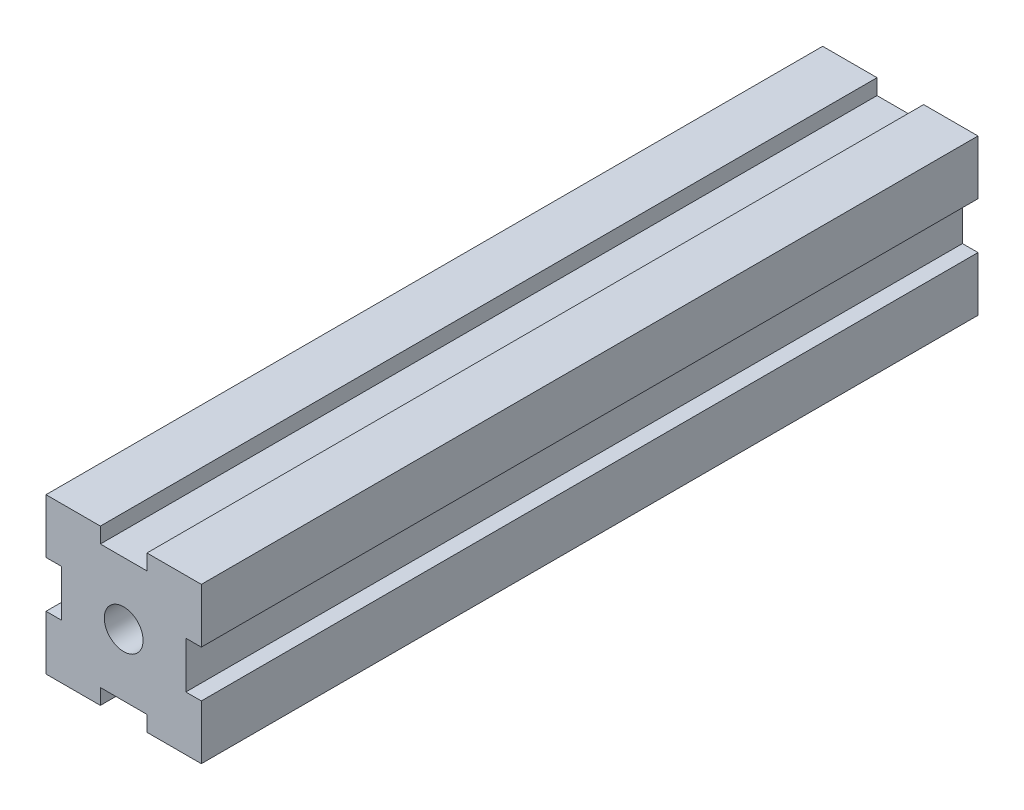
ISO-10303-21;
HEADER;
FILE_DESCRIPTION(('STEP AP214'),'2;1');
FILE_NAME('part.step','',(''),(''),'','','');
FILE_SCHEMA(('AUTOMOTIVE_DESIGN { 1 0 10303 214 1 1 1 1 }'));
ENDSEC;
DATA;
#1=APPLICATION_CONTEXT('core data for automotive mechanical design processes');
#2=APPLICATION_PROTOCOL_DEFINITION('international standard','automotive_design',2000,#1);
#3=PRODUCT_CONTEXT('',#1,'mechanical');
#4=PRODUCT('Part','Part','',(#3));
#5=PRODUCT_RELATED_PRODUCT_CATEGORY('part','',(#4));
#6=PRODUCT_DEFINITION_FORMATION('','',#4);
#7=PRODUCT_DEFINITION_CONTEXT('part definition',#1,'design');
#8=PRODUCT_DEFINITION('design','',#6,#7);
#9=PRODUCT_DEFINITION_SHAPE('','',#8);
#10=(LENGTH_UNIT() NAMED_UNIT(*) SI_UNIT(.MILLI.,.METRE.));
#11=(NAMED_UNIT(*) PLANE_ANGLE_UNIT() SI_UNIT($,.RADIAN.));
#12=(NAMED_UNIT(*) SI_UNIT($,.STERADIAN.) SOLID_ANGLE_UNIT());
#13=UNCERTAINTY_MEASURE_WITH_UNIT(LENGTH_MEASURE(1.E-05),#10,'distance_accuracy_value','');
#14=(GEOMETRIC_REPRESENTATION_CONTEXT(3) GLOBAL_UNCERTAINTY_ASSIGNED_CONTEXT((#13)) GLOBAL_UNIT_ASSIGNED_CONTEXT((#10,
#11,#12)) REPRESENTATION_CONTEXT('',''));
#15=CARTESIAN_POINT('',(0.,0.,0.));
#16=DIRECTION('',(0.,0.,1.));
#17=DIRECTION('',(1.,0.,0.));
#18=AXIS2_PLACEMENT_3D('',#15,#16,#17);
#19=CARTESIAN_POINT('',(0.,0.,100.));
#20=DIRECTION('',(0.,0.,1.));
#21=DIRECTION('',(1.,0.,0.));
#22=AXIS2_PLACEMENT_3D('',#19,#20,#21);
#23=PLANE('',#22);
#24=DIRECTION('',(0.,-1.,0.));
#25=VECTOR('',#24,1.);
#26=CARTESIAN_POINT('',(0.,0.,100.));
#27=LINE('',#26,#25);
#28=CARTESIAN_POINT('',(0.,0.,100.));
#29=VERTEX_POINT('',#28);
#30=CARTESIAN_POINT('',(0.,-7.,100.));
#31=VERTEX_POINT('',#30);
#32=EDGE_CURVE('E242',#29,#31,#27,.T.);
#33=ORIENTED_EDGE('',*,*,#32,.T.);
#34=DIRECTION('',(1.,0.,0.));
#35=VECTOR('',#34,1.);
#36=CARTESIAN_POINT('',(0.,-7.,100.));
#37=LINE('',#36,#35);
#38=CARTESIAN_POINT('',(2.,-7.,100.));
#39=VERTEX_POINT('',#38);
#40=EDGE_CURVE('E130',#31,#39,#37,.T.);
#41=ORIENTED_EDGE('',*,*,#40,.T.);
#42=DIRECTION('',(0.,-1.,0.));
#43=VECTOR('',#42,1.);
#44=CARTESIAN_POINT('',(2.,-7.,100.));
#45=LINE('',#44,#43);
#46=CARTESIAN_POINT('',(2.,-13.,100.));
#47=VERTEX_POINT('',#46);
#48=EDGE_CURVE('E293',#39,#47,#45,.T.);
#49=ORIENTED_EDGE('',*,*,#48,.T.);
#50=DIRECTION('',(-1.,0.,0.));
#51=VECTOR('',#50,1.);
#52=CARTESIAN_POINT('',(0.,-13.,100.));
#53=LINE('',#52,#51);
#54=CARTESIAN_POINT('',(0.,-13.,100.));
#55=VERTEX_POINT('',#54);
#56=EDGE_CURVE('E312',#47,#55,#53,.T.);
#57=ORIENTED_EDGE('',*,*,#56,.T.);
#58=DIRECTION('',(0.,-1.,0.));
#59=VECTOR('',#58,1.);
#60=CARTESIAN_POINT('',(0.,-13.,100.));
#61=LINE('',#60,#59);
#62=CARTESIAN_POINT('',(0.,-20.,100.));
#63=VERTEX_POINT('',#62);
#64=EDGE_CURVE('E309',#55,#63,#61,.T.);
#65=ORIENTED_EDGE('',*,*,#64,.T.);
#66=DIRECTION('',(1.,0.,0.));
#67=VECTOR('',#66,1.);
#68=CARTESIAN_POINT('',(0.,-20.,100.));
#69=LINE('',#68,#67);
#70=CARTESIAN_POINT('',(7.,-20.,100.));
#71=VERTEX_POINT('',#70);
#72=EDGE_CURVE('E311',#63,#71,#69,.T.);
#73=ORIENTED_EDGE('',*,*,#72,.T.);
#74=DIRECTION('',(0.,1.,0.));
#75=VECTOR('',#74,1.);
#76=CARTESIAN_POINT('',(7.,-20.,100.));
#77=LINE('',#76,#75);
#78=CARTESIAN_POINT('',(7.,-18.,100.));
#79=VERTEX_POINT('',#78);
#80=EDGE_CURVE('E314',#71,#79,#77,.T.);
#81=ORIENTED_EDGE('',*,*,#80,.T.);
#82=DIRECTION('',(1.,0.,0.));
#83=VECTOR('',#82,1.);
#84=CARTESIAN_POINT('',(7.,-18.,100.));
#85=LINE('',#84,#83);
#86=CARTESIAN_POINT('',(13.,-18.,100.));
#87=VERTEX_POINT('',#86);
#88=EDGE_CURVE('E320',#79,#87,#85,.T.);
#89=ORIENTED_EDGE('',*,*,#88,.T.);
#90=DIRECTION('',(0.,-1.,0.));
#91=VECTOR('',#90,1.);
#92=CARTESIAN_POINT('',(13.,-20.,100.));
#93=LINE('',#92,#91);
#94=CARTESIAN_POINT('',(13.,-20.,100.));
#95=VERTEX_POINT('',#94);
#96=EDGE_CURVE('E322',#87,#95,#93,.T.);
#97=ORIENTED_EDGE('',*,*,#96,.T.);
#98=DIRECTION('',(1.,0.,0.));
#99=VECTOR('',#98,1.);
#100=CARTESIAN_POINT('',(13.,-20.,100.));
#101=LINE('',#100,#99);
#102=CARTESIAN_POINT('',(20.,-20.,100.));
#103=VERTEX_POINT('',#102);
#104=EDGE_CURVE('E324',#95,#103,#101,.T.);
#105=ORIENTED_EDGE('',*,*,#104,.T.);
#106=DIRECTION('',(0.,1.,0.));
#107=VECTOR('',#106,1.);
#108=CARTESIAN_POINT('',(20.,-13.,100.));
#109=LINE('',#108,#107);
#110=CARTESIAN_POINT('',(20.,-13.,100.));
#111=VERTEX_POINT('',#110);
#112=EDGE_CURVE('E326',#103,#111,#109,.T.);
#113=ORIENTED_EDGE('',*,*,#112,.T.);
#114=DIRECTION('',(-1.,0.,0.));
#115=VECTOR('',#114,1.);
#116=CARTESIAN_POINT('',(20.,-13.,100.));
#117=LINE('',#116,#115);
#118=CARTESIAN_POINT('',(18.,-13.,100.));
#119=VERTEX_POINT('',#118);
#120=EDGE_CURVE('E328',#111,#119,#117,.T.);
#121=ORIENTED_EDGE('',*,*,#120,.T.);
#122=DIRECTION('',(0.,1.,0.));
#123=VECTOR('',#122,1.);
#124=CARTESIAN_POINT('',(18.,-7.,100.));
#125=LINE('',#124,#123);
#126=CARTESIAN_POINT('',(18.,-7.,100.));
#127=VERTEX_POINT('',#126);
#128=EDGE_CURVE('E330',#119,#127,#125,.T.);
#129=ORIENTED_EDGE('',*,*,#128,.T.);
#130=DIRECTION('',(1.,0.,0.));
#131=VECTOR('',#130,1.);
#132=CARTESIAN_POINT('',(20.,-7.,100.));
#133=LINE('',#132,#131);
#134=CARTESIAN_POINT('',(20.,-7.,100.));
#135=VERTEX_POINT('',#134);
#136=EDGE_CURVE('E332',#127,#135,#133,.T.);
#137=ORIENTED_EDGE('',*,*,#136,.T.);
#138=DIRECTION('',(0.,1.,0.));
#139=VECTOR('',#138,1.);
#140=CARTESIAN_POINT('',(20.,0.,100.));
#141=LINE('',#140,#139);
#142=CARTESIAN_POINT('',(20.,0.,100.));
#143=VERTEX_POINT('',#142);
#144=EDGE_CURVE('E334',#135,#143,#141,.T.);
#145=ORIENTED_EDGE('',*,*,#144,.T.);
#146=DIRECTION('',(-1.,0.,0.));
#147=VECTOR('',#146,1.);
#148=CARTESIAN_POINT('',(13.,0.,100.));
#149=LINE('',#148,#147);
#150=CARTESIAN_POINT('',(13.,0.,100.));
#151=VERTEX_POINT('',#150);
#152=EDGE_CURVE('E336',#143,#151,#149,.T.);
#153=ORIENTED_EDGE('',*,*,#152,.T.);
#154=DIRECTION('',(0.,-1.,0.));
#155=VECTOR('',#154,1.);
#156=CARTESIAN_POINT('',(13.,0.,100.));
#157=LINE('',#156,#155);
#158=CARTESIAN_POINT('',(13.,-2.,100.));
#159=VERTEX_POINT('',#158);
#160=EDGE_CURVE('E185',#151,#159,#157,.T.);
#161=ORIENTED_EDGE('',*,*,#160,.T.);
#162=DIRECTION('',(-1.,0.,0.));
#163=VECTOR('',#162,1.);
#164=CARTESIAN_POINT('',(7.,-2.,100.));
#165=LINE('',#164,#163);
#166=CARTESIAN_POINT('',(7.,-2.,100.));
#167=VERTEX_POINT('',#166);
#168=EDGE_CURVE('E179',#159,#167,#165,.T.);
#169=ORIENTED_EDGE('',*,*,#168,.T.);
#170=DIRECTION('',(0.,1.,0.));
#171=VECTOR('',#170,1.);
#172=CARTESIAN_POINT('',(7.,0.,100.));
#173=LINE('',#172,#171);
#174=CARTESIAN_POINT('',(7.,0.,100.));
#175=VERTEX_POINT('',#174);
#176=EDGE_CURVE('E183',#167,#175,#173,.T.);
#177=ORIENTED_EDGE('',*,*,#176,.T.);
#178=DIRECTION('',(-1.,0.,0.));
#179=VECTOR('',#178,1.);
#180=CARTESIAN_POINT('',(0.,0.,100.));
#181=LINE('',#180,#179);
#182=EDGE_CURVE('E51',#175,#29,#181,.T.);
#183=ORIENTED_EDGE('',*,*,#182,.T.);
#184=EDGE_LOOP('',(#33,#41,#49,#57,#65,#73,#81,#89,#97,#105,#113,#121,#129,#137,#145,#153,#161,
#169,#177,#183));
#185=FACE_BOUND('',#184,.T.);
#186=CARTESIAN_POINT('',(10.,-10.,100.));
#187=DIRECTION('',(0.,0.,1.));
#188=DIRECTION('',(1.,0.,0.));
#189=AXIS2_PLACEMENT_3D('',#186,#187,#188);
#190=CIRCLE('',#189,2.5);
#191=CARTESIAN_POINT('',(12.5,-10.,100.));
#192=VERTEX_POINT('',#191);
#193=EDGE_CURVE('E207',#192,#192,#190,.T.);
#194=ORIENTED_EDGE('',*,*,#193,.F.);
#195=EDGE_LOOP('',(#194));
#196=FACE_BOUND('',#195,.T.);
#197=ADVANCED_FACE('F34',(#185,#196),#23,.T.);
#198=CARTESIAN_POINT('',(0.,0.,0.));
#199=DIRECTION('',(0.,0.,1.));
#200=DIRECTION('',(1.,0.,0.));
#201=AXIS2_PLACEMENT_3D('',#198,#199,#200);
#202=PLANE('',#201);
#203=DIRECTION('',(0.,-1.,0.));
#204=VECTOR('',#203,1.);
#205=CARTESIAN_POINT('',(0.,0.,0.));
#206=LINE('',#205,#204);
#207=CARTESIAN_POINT('',(0.,0.,0.));
#208=VERTEX_POINT('',#207);
#209=CARTESIAN_POINT('',(0.,-7.,0.));
#210=VERTEX_POINT('',#209);
#211=EDGE_CURVE('E203',#208,#210,#206,.T.);
#212=ORIENTED_EDGE('',*,*,#211,.F.);
#213=DIRECTION('',(-1.,0.,0.));
#214=VECTOR('',#213,1.);
#215=CARTESIAN_POINT('',(0.,0.,0.));
#216=LINE('',#215,#214);
#217=CARTESIAN_POINT('',(7.,0.,0.));
#218=VERTEX_POINT('',#217);
#219=EDGE_CURVE('E122',#218,#208,#216,.T.);
#220=ORIENTED_EDGE('',*,*,#219,.F.);
#221=DIRECTION('',(0.,1.,0.));
#222=VECTOR('',#221,1.);
#223=CARTESIAN_POINT('',(7.,0.,0.));
#224=LINE('',#223,#222);
#225=CARTESIAN_POINT('',(7.,-2.,0.));
#226=VERTEX_POINT('',#225);
#227=EDGE_CURVE('E116',#226,#218,#224,.T.);
#228=ORIENTED_EDGE('',*,*,#227,.F.);
#229=DIRECTION('',(-1.,0.,0.));
#230=VECTOR('',#229,1.);
#231=CARTESIAN_POINT('',(7.,-2.,0.));
#232=LINE('',#231,#230);
#233=CARTESIAN_POINT('',(13.,-2.,0.));
#234=VERTEX_POINT('',#233);
#235=EDGE_CURVE('E193',#234,#226,#232,.T.);
#236=ORIENTED_EDGE('',*,*,#235,.F.);
#237=DIRECTION('',(0.,-1.,0.));
#238=VECTOR('',#237,1.);
#239=CARTESIAN_POINT('',(13.,0.,0.));
#240=LINE('',#239,#238);
#241=CARTESIAN_POINT('',(13.,0.,0.));
#242=VERTEX_POINT('',#241);
#243=EDGE_CURVE('E237',#242,#234,#240,.T.);
#244=ORIENTED_EDGE('',*,*,#243,.F.);
#245=DIRECTION('',(-1.,0.,0.));
#246=VECTOR('',#245,1.);
#247=CARTESIAN_POINT('',(13.,0.,0.));
#248=LINE('',#247,#246);
#249=CARTESIAN_POINT('',(20.,0.,0.));
#250=VERTEX_POINT('',#249);
#251=EDGE_CURVE('E235',#250,#242,#248,.T.);
#252=ORIENTED_EDGE('',*,*,#251,.F.);
#253=DIRECTION('',(0.,1.,0.));
#254=VECTOR('',#253,1.);
#255=CARTESIAN_POINT('',(20.,0.,0.));
#256=LINE('',#255,#254);
#257=CARTESIAN_POINT('',(20.,-7.,0.));
#258=VERTEX_POINT('',#257);
#259=EDGE_CURVE('E233',#258,#250,#256,.T.);
#260=ORIENTED_EDGE('',*,*,#259,.F.);
#261=DIRECTION('',(1.,0.,0.));
#262=VECTOR('',#261,1.);
#263=CARTESIAN_POINT('',(20.,-7.,0.));
#264=LINE('',#263,#262);
#265=CARTESIAN_POINT('',(18.,-7.,0.));
#266=VERTEX_POINT('',#265);
#267=EDGE_CURVE('E231',#266,#258,#264,.T.);
#268=ORIENTED_EDGE('',*,*,#267,.F.);
#269=DIRECTION('',(0.,1.,0.));
#270=VECTOR('',#269,1.);
#271=CARTESIAN_POINT('',(18.,-7.,0.));
#272=LINE('',#271,#270);
#273=CARTESIAN_POINT('',(18.,-13.,0.));
#274=VERTEX_POINT('',#273);
#275=EDGE_CURVE('E229',#274,#266,#272,.T.);
#276=ORIENTED_EDGE('',*,*,#275,.F.);
#277=DIRECTION('',(-1.,0.,0.));
#278=VECTOR('',#277,1.);
#279=CARTESIAN_POINT('',(20.,-13.,0.));
#280=LINE('',#279,#278);
#281=CARTESIAN_POINT('',(20.,-13.,0.));
#282=VERTEX_POINT('',#281);
#283=EDGE_CURVE('E227',#282,#274,#280,.T.);
#284=ORIENTED_EDGE('',*,*,#283,.F.);
#285=DIRECTION('',(0.,1.,0.));
#286=VECTOR('',#285,1.);
#287=CARTESIAN_POINT('',(20.,-13.,0.));
#288=LINE('',#287,#286);
#289=CARTESIAN_POINT('',(20.,-20.,0.));
#290=VERTEX_POINT('',#289);
#291=EDGE_CURVE('E225',#290,#282,#288,.T.);
#292=ORIENTED_EDGE('',*,*,#291,.F.);
#293=DIRECTION('',(1.,0.,0.));
#294=VECTOR('',#293,1.);
#295=CARTESIAN_POINT('',(13.,-20.,0.));
#296=LINE('',#295,#294);
#297=CARTESIAN_POINT('',(13.,-20.,0.));
#298=VERTEX_POINT('',#297);
#299=EDGE_CURVE('E223',#298,#290,#296,.T.);
#300=ORIENTED_EDGE('',*,*,#299,.F.);
#301=DIRECTION('',(0.,-1.,0.));
#302=VECTOR('',#301,1.);
#303=CARTESIAN_POINT('',(13.,-20.,0.));
#304=LINE('',#303,#302);
#305=CARTESIAN_POINT('',(13.,-18.,0.));
#306=VERTEX_POINT('',#305);
#307=EDGE_CURVE('E221',#306,#298,#304,.T.);
#308=ORIENTED_EDGE('',*,*,#307,.F.);
#309=DIRECTION('',(1.,0.,0.));
#310=VECTOR('',#309,1.);
#311=CARTESIAN_POINT('',(7.,-18.,0.));
#312=LINE('',#311,#310);
#313=CARTESIAN_POINT('',(7.,-18.,0.));
#314=VERTEX_POINT('',#313);
#315=EDGE_CURVE('E219',#314,#306,#312,.T.);
#316=ORIENTED_EDGE('',*,*,#315,.F.);
#317=DIRECTION('',(0.,1.,0.));
#318=VECTOR('',#317,1.);
#319=CARTESIAN_POINT('',(7.,-20.,0.));
#320=LINE('',#319,#318);
#321=CARTESIAN_POINT('',(7.,-20.,0.));
#322=VERTEX_POINT('',#321);
#323=EDGE_CURVE('E217',#322,#314,#320,.T.);
#324=ORIENTED_EDGE('',*,*,#323,.F.);
#325=DIRECTION('',(1.,0.,0.));
#326=VECTOR('',#325,1.);
#327=CARTESIAN_POINT('',(0.,-20.,0.));
#328=LINE('',#327,#326);
#329=CARTESIAN_POINT('',(0.,-20.,0.));
#330=VERTEX_POINT('',#329);
#331=EDGE_CURVE('E215',#330,#322,#328,.T.);
#332=ORIENTED_EDGE('',*,*,#331,.F.);
#333=DIRECTION('',(0.,-1.,0.));
#334=VECTOR('',#333,1.);
#335=CARTESIAN_POINT('',(0.,-13.,0.));
#336=LINE('',#335,#334);
#337=CARTESIAN_POINT('',(0.,-13.,0.));
#338=VERTEX_POINT('',#337);
#339=EDGE_CURVE('E213',#338,#330,#336,.T.);
#340=ORIENTED_EDGE('',*,*,#339,.F.);
#341=DIRECTION('',(-1.,0.,0.));
#342=VECTOR('',#341,1.);
#343=CARTESIAN_POINT('',(0.,-13.,0.));
#344=LINE('',#343,#342);
#345=CARTESIAN_POINT('',(2.,-13.,0.));
#346=VERTEX_POINT('',#345);
#347=EDGE_CURVE('E211',#346,#338,#344,.T.);
#348=ORIENTED_EDGE('',*,*,#347,.F.);
#349=DIRECTION('',(0.,-1.,0.));
#350=VECTOR('',#349,1.);
#351=CARTESIAN_POINT('',(2.,-7.,0.));
#352=LINE('',#351,#350);
#353=CARTESIAN_POINT('',(2.,-7.,0.));
#354=VERTEX_POINT('',#353);
#355=EDGE_CURVE('E209',#354,#346,#352,.T.);
#356=ORIENTED_EDGE('',*,*,#355,.F.);
#357=DIRECTION('',(1.,0.,0.));
#358=VECTOR('',#357,1.);
#359=CARTESIAN_POINT('',(0.,-7.,0.));
#360=LINE('',#359,#358);
#361=EDGE_CURVE('E206',#210,#354,#360,.T.);
#362=ORIENTED_EDGE('',*,*,#361,.F.);
#363=EDGE_LOOP('',(#212,#220,#228,#236,#244,#252,#260,#268,#276,#284,#292,#300,#308,#316,#324,
#332,#340,#348,#356,#362));
#364=FACE_BOUND('',#363,.T.);
#365=CARTESIAN_POINT('',(10.,-10.,0.));
#366=DIRECTION('',(0.,0.,1.));
#367=DIRECTION('',(1.,0.,0.));
#368=AXIS2_PLACEMENT_3D('',#365,#366,#367);
#369=CIRCLE('',#368,2.5);
#370=CARTESIAN_POINT('',(12.5,-10.,0.));
#371=VERTEX_POINT('',#370);
#372=EDGE_CURVE('E587',#371,#371,#369,.T.);
#373=ORIENTED_EDGE('',*,*,#372,.T.);
#374=EDGE_LOOP('',(#373));
#375=FACE_BOUND('',#374,.T.);
#376=ADVANCED_FACE('F297',(#364,#375),#202,.F.);
#377=CARTESIAN_POINT('',(0.,0.,100.));
#378=DIRECTION('',(1.,0.,0.));
#379=DIRECTION('',(0.,1.,0.));
#380=AXIS2_PLACEMENT_3D('',#377,#378,#379);
#381=PLANE('',#380);
#382=ORIENTED_EDGE('',*,*,#211,.T.);
#383=DIRECTION('',(0.,0.,-1.));
#384=VECTOR('',#383,1.);
#385=CARTESIAN_POINT('',(0.,-7.,100.));
#386=LINE('',#385,#384);
#387=EDGE_CURVE('E11',#31,#210,#386,.T.);
#388=ORIENTED_EDGE('',*,*,#387,.F.);
#389=ORIENTED_EDGE('',*,*,#32,.F.);
#390=DIRECTION('',(0.,0.,-1.));
#391=VECTOR('',#390,1.);
#392=CARTESIAN_POINT('',(0.,0.,100.));
#393=LINE('',#392,#391);
#394=EDGE_CURVE('E199',#29,#208,#393,.T.);
#395=ORIENTED_EDGE('',*,*,#394,.T.);
#396=EDGE_LOOP('',(#382,#388,#389,#395));
#397=FACE_BOUND('',#396,.T.);
#398=ADVANCED_FACE('F36',(#397),#381,.F.);
#399=CARTESIAN_POINT('',(0.,-7.,100.));
#400=DIRECTION('',(0.,1.,0.));
#401=DIRECTION('',(-1.,0.,0.));
#402=AXIS2_PLACEMENT_3D('',#399,#400,#401);
#403=PLANE('',#402);
#404=ORIENTED_EDGE('',*,*,#361,.T.);
#405=DIRECTION('',(0.,0.,-1.));
#406=VECTOR('',#405,1.);
#407=CARTESIAN_POINT('',(2.,-7.,100.));
#408=LINE('',#407,#406);
#409=EDGE_CURVE('E43',#39,#354,#408,.T.);
#410=ORIENTED_EDGE('',*,*,#409,.F.);
#411=ORIENTED_EDGE('',*,*,#40,.F.);
#412=ORIENTED_EDGE('',*,*,#387,.T.);
#413=EDGE_LOOP('',(#404,#410,#411,#412));
#414=FACE_BOUND('',#413,.T.);
#415=ADVANCED_FACE('F370',(#414),#403,.F.);
#416=CARTESIAN_POINT('',(2.,-7.,100.));
#417=DIRECTION('',(1.,0.,0.));
#418=DIRECTION('',(0.,0.,-1.));
#419=AXIS2_PLACEMENT_3D('',#416,#417,#418);
#420=PLANE('',#419);
#421=ORIENTED_EDGE('',*,*,#355,.T.);
#422=DIRECTION('',(0.,0.,-1.));
#423=VECTOR('',#422,1.);
#424=CARTESIAN_POINT('',(2.,-13.,100.));
#425=LINE('',#424,#423);
#426=EDGE_CURVE('E285',#47,#346,#425,.T.);
#427=ORIENTED_EDGE('',*,*,#426,.F.);
#428=ORIENTED_EDGE('',*,*,#48,.F.);
#429=ORIENTED_EDGE('',*,*,#409,.T.);
#430=EDGE_LOOP('',(#421,#427,#428,#429));
#431=FACE_BOUND('',#430,.T.);
#432=ADVANCED_FACE('F291',(#431),#420,.F.);
#433=CARTESIAN_POINT('',(0.,-13.,100.));
#434=DIRECTION('',(0.,-1.,0.));
#435=DIRECTION('',(1.,0.,0.));
#436=AXIS2_PLACEMENT_3D('',#433,#434,#435);
#437=PLANE('',#436);
#438=ORIENTED_EDGE('',*,*,#347,.T.);
#439=DIRECTION('',(0.,0.,-1.));
#440=VECTOR('',#439,1.);
#441=CARTESIAN_POINT('',(0.,-13.,100.));
#442=LINE('',#441,#440);
#443=EDGE_CURVE('E282',#55,#338,#442,.T.);
#444=ORIENTED_EDGE('',*,*,#443,.F.);
#445=ORIENTED_EDGE('',*,*,#56,.F.);
#446=ORIENTED_EDGE('',*,*,#426,.T.);
#447=EDGE_LOOP('',(#438,#444,#445,#446));
#448=FACE_BOUND('',#447,.T.);
#449=ADVANCED_FACE('F303',(#448),#437,.F.);
#450=CARTESIAN_POINT('',(0.,-13.,100.));
#451=DIRECTION('',(1.,0.,0.));
#452=DIRECTION('',(0.,1.,0.));
#453=AXIS2_PLACEMENT_3D('',#450,#451,#452);
#454=PLANE('',#453);
#455=ORIENTED_EDGE('',*,*,#339,.T.);
#456=DIRECTION('',(0.,0.,-1.));
#457=VECTOR('',#456,1.);
#458=CARTESIAN_POINT('',(0.,-20.,100.));
#459=LINE('',#458,#457);
#460=EDGE_CURVE('E279',#63,#330,#459,.T.);
#461=ORIENTED_EDGE('',*,*,#460,.F.);
#462=ORIENTED_EDGE('',*,*,#64,.F.);
#463=ORIENTED_EDGE('',*,*,#443,.T.);
#464=EDGE_LOOP('',(#455,#461,#462,#463));
#465=FACE_BOUND('',#464,.T.);
#466=ADVANCED_FACE('F307',(#465),#454,.F.);
#467=CARTESIAN_POINT('',(0.,-20.,100.));
#468=DIRECTION('',(0.,1.,0.));
#469=DIRECTION('',(0.,0.,1.));
#470=AXIS2_PLACEMENT_3D('',#467,#468,#469);
#471=PLANE('',#470);
#472=ORIENTED_EDGE('',*,*,#331,.T.);
#473=DIRECTION('',(0.,0.,-1.));
#474=VECTOR('',#473,1.);
#475=CARTESIAN_POINT('',(7.,-20.,100.));
#476=LINE('',#475,#474);
#477=EDGE_CURVE('E276',#71,#322,#476,.T.);
#478=ORIENTED_EDGE('',*,*,#477,.F.);
#479=ORIENTED_EDGE('',*,*,#72,.F.);
#480=ORIENTED_EDGE('',*,*,#460,.T.);
#481=EDGE_LOOP('',(#472,#478,#479,#480));
#482=FACE_BOUND('',#481,.T.);
#483=ADVANCED_FACE('F383',(#482),#471,.F.);
#484=CARTESIAN_POINT('',(7.,-20.,100.));
#485=DIRECTION('',(-1.,0.,0.));
#486=DIRECTION('',(0.,-1.,0.));
#487=AXIS2_PLACEMENT_3D('',#484,#485,#486);
#488=PLANE('',#487);
#489=ORIENTED_EDGE('',*,*,#323,.T.);
#490=DIRECTION('',(0.,0.,-1.));
#491=VECTOR('',#490,1.);
#492=CARTESIAN_POINT('',(7.,-18.,100.));
#493=LINE('',#492,#491);
#494=EDGE_CURVE('E273',#79,#314,#493,.T.);
#495=ORIENTED_EDGE('',*,*,#494,.F.);
#496=ORIENTED_EDGE('',*,*,#80,.F.);
#497=ORIENTED_EDGE('',*,*,#477,.T.);
#498=EDGE_LOOP('',(#489,#495,#496,#497));
#499=FACE_BOUND('',#498,.T.);
#500=ADVANCED_FACE('F386',(#499),#488,.F.);
#501=CARTESIAN_POINT('',(7.,-18.,100.));
#502=DIRECTION('',(0.,1.,0.));
#503=DIRECTION('',(0.,0.,1.));
#504=AXIS2_PLACEMENT_3D('',#501,#502,#503);
#505=PLANE('',#504);
#506=ORIENTED_EDGE('',*,*,#315,.T.);
#507=DIRECTION('',(0.,0.,-1.));
#508=VECTOR('',#507,1.);
#509=CARTESIAN_POINT('',(13.,-18.,100.));
#510=LINE('',#509,#508);
#511=EDGE_CURVE('E270',#87,#306,#510,.T.);
#512=ORIENTED_EDGE('',*,*,#511,.F.);
#513=ORIENTED_EDGE('',*,*,#88,.F.);
#514=ORIENTED_EDGE('',*,*,#494,.T.);
#515=EDGE_LOOP('',(#506,#512,#513,#514));
#516=FACE_BOUND('',#515,.T.);
#517=ADVANCED_FACE('F390',(#516),#505,.F.);
#518=CARTESIAN_POINT('',(13.,-20.,100.));
#519=DIRECTION('',(1.,0.,0.));
#520=DIRECTION('',(0.,1.,0.));
#521=AXIS2_PLACEMENT_3D('',#518,#519,#520);
#522=PLANE('',#521);
#523=ORIENTED_EDGE('',*,*,#307,.T.);
#524=DIRECTION('',(0.,0.,-1.));
#525=VECTOR('',#524,1.);
#526=CARTESIAN_POINT('',(13.,-20.,100.));
#527=LINE('',#526,#525);
#528=EDGE_CURVE('E267',#95,#298,#527,.T.);
#529=ORIENTED_EDGE('',*,*,#528,.F.);
#530=ORIENTED_EDGE('',*,*,#96,.F.);
#531=ORIENTED_EDGE('',*,*,#511,.T.);
#532=EDGE_LOOP('',(#523,#529,#530,#531));
#533=FACE_BOUND('',#532,.T.);
#534=ADVANCED_FACE('F394',(#533),#522,.F.);
#535=CARTESIAN_POINT('',(13.,-20.,100.));
#536=DIRECTION('',(0.,1.,0.));
#537=DIRECTION('',(0.,0.,1.));
#538=AXIS2_PLACEMENT_3D('',#535,#536,#537);
#539=PLANE('',#538);
#540=ORIENTED_EDGE('',*,*,#299,.T.);
#541=DIRECTION('',(0.,0.,-1.));
#542=VECTOR('',#541,1.);
#543=CARTESIAN_POINT('',(20.,-20.,100.));
#544=LINE('',#543,#542);
#545=EDGE_CURVE('E264',#103,#290,#544,.T.);
#546=ORIENTED_EDGE('',*,*,#545,.F.);
#547=ORIENTED_EDGE('',*,*,#104,.F.);
#548=ORIENTED_EDGE('',*,*,#528,.T.);
#549=EDGE_LOOP('',(#540,#546,#547,#548));
#550=FACE_BOUND('',#549,.T.);
#551=ADVANCED_FACE('F398',(#550),#539,.F.);
#552=CARTESIAN_POINT('',(20.,-13.,100.));
#553=DIRECTION('',(-1.,0.,0.));
#554=DIRECTION('',(0.,0.,1.));
#555=AXIS2_PLACEMENT_3D('',#552,#553,#554);
#556=PLANE('',#555);
#557=ORIENTED_EDGE('',*,*,#291,.T.);
#558=DIRECTION('',(0.,0.,-1.));
#559=VECTOR('',#558,1.);
#560=CARTESIAN_POINT('',(20.,-13.,100.));
#561=LINE('',#560,#559);
#562=EDGE_CURVE('E261',#111,#282,#561,.T.);
#563=ORIENTED_EDGE('',*,*,#562,.F.);
#564=ORIENTED_EDGE('',*,*,#112,.F.);
#565=ORIENTED_EDGE('',*,*,#545,.T.);
#566=EDGE_LOOP('',(#557,#563,#564,#565));
#567=FACE_BOUND('',#566,.T.);
#568=ADVANCED_FACE('F402',(#567),#556,.F.);
#569=CARTESIAN_POINT('',(20.,-13.,100.));
#570=DIRECTION('',(0.,-1.,0.));
#571=DIRECTION('',(1.,0.,0.));
#572=AXIS2_PLACEMENT_3D('',#569,#570,#571);
#573=PLANE('',#572);
#574=ORIENTED_EDGE('',*,*,#283,.T.);
#575=DIRECTION('',(0.,0.,-1.));
#576=VECTOR('',#575,1.);
#577=CARTESIAN_POINT('',(18.,-13.,100.));
#578=LINE('',#577,#576);
#579=EDGE_CURVE('E258',#119,#274,#578,.T.);
#580=ORIENTED_EDGE('',*,*,#579,.F.);
#581=ORIENTED_EDGE('',*,*,#120,.F.);
#582=ORIENTED_EDGE('',*,*,#562,.T.);
#583=EDGE_LOOP('',(#574,#580,#581,#582));
#584=FACE_BOUND('',#583,.T.);
#585=ADVANCED_FACE('F406',(#584),#573,.F.);
#586=CARTESIAN_POINT('',(18.,-7.,100.));
#587=DIRECTION('',(-1.,0.,0.));
#588=DIRECTION('',(0.,0.,1.));
#589=AXIS2_PLACEMENT_3D('',#586,#587,#588);
#590=PLANE('',#589);
#591=ORIENTED_EDGE('',*,*,#275,.T.);
#592=DIRECTION('',(0.,0.,-1.));
#593=VECTOR('',#592,1.);
#594=CARTESIAN_POINT('',(18.,-7.,100.));
#595=LINE('',#594,#593);
#596=EDGE_CURVE('E255',#127,#266,#595,.T.);
#597=ORIENTED_EDGE('',*,*,#596,.F.);
#598=ORIENTED_EDGE('',*,*,#128,.F.);
#599=ORIENTED_EDGE('',*,*,#579,.T.);
#600=EDGE_LOOP('',(#591,#597,#598,#599));
#601=FACE_BOUND('',#600,.T.);
#602=ADVANCED_FACE('F410',(#601),#590,.F.);
#603=CARTESIAN_POINT('',(20.,-7.,100.));
#604=DIRECTION('',(0.,1.,0.));
#605=DIRECTION('',(-1.,0.,0.));
#606=AXIS2_PLACEMENT_3D('',#603,#604,#605);
#607=PLANE('',#606);
#608=ORIENTED_EDGE('',*,*,#267,.T.);
#609=DIRECTION('',(0.,0.,-1.));
#610=VECTOR('',#609,1.);
#611=CARTESIAN_POINT('',(20.,-7.,100.));
#612=LINE('',#611,#610);
#613=EDGE_CURVE('E252',#135,#258,#612,.T.);
#614=ORIENTED_EDGE('',*,*,#613,.F.);
#615=ORIENTED_EDGE('',*,*,#136,.F.);
#616=ORIENTED_EDGE('',*,*,#596,.T.);
#617=EDGE_LOOP('',(#608,#614,#615,#616));
#618=FACE_BOUND('',#617,.T.);
#619=ADVANCED_FACE('F414',(#618),#607,.F.);
#620=CARTESIAN_POINT('',(20.,0.,100.));
#621=DIRECTION('',(-1.,0.,0.));
#622=DIRECTION('',(0.,-1.,0.));
#623=AXIS2_PLACEMENT_3D('',#620,#621,#622);
#624=PLANE('',#623);
#625=ORIENTED_EDGE('',*,*,#259,.T.);
#626=DIRECTION('',(0.,0.,-1.));
#627=VECTOR('',#626,1.);
#628=CARTESIAN_POINT('',(20.,0.,100.));
#629=LINE('',#628,#627);
#630=EDGE_CURVE('E249',#143,#250,#629,.T.);
#631=ORIENTED_EDGE('',*,*,#630,.F.);
#632=ORIENTED_EDGE('',*,*,#144,.F.);
#633=ORIENTED_EDGE('',*,*,#613,.T.);
#634=EDGE_LOOP('',(#625,#631,#632,#633));
#635=FACE_BOUND('',#634,.T.);
#636=ADVANCED_FACE('F418',(#635),#624,.F.);
#637=CARTESIAN_POINT('',(13.,0.,100.));
#638=DIRECTION('',(0.,-1.,0.));
#639=DIRECTION('',(0.,0.,-1.));
#640=AXIS2_PLACEMENT_3D('',#637,#638,#639);
#641=PLANE('',#640);
#642=ORIENTED_EDGE('',*,*,#251,.T.);
#643=DIRECTION('',(0.,0.,-1.));
#644=VECTOR('',#643,1.);
#645=CARTESIAN_POINT('',(13.,0.,100.));
#646=LINE('',#645,#644);
#647=EDGE_CURVE('E246',#151,#242,#646,.T.);
#648=ORIENTED_EDGE('',*,*,#647,.F.);
#649=ORIENTED_EDGE('',*,*,#152,.F.);
#650=ORIENTED_EDGE('',*,*,#630,.T.);
#651=EDGE_LOOP('',(#642,#648,#649,#650));
#652=FACE_BOUND('',#651,.T.);
#653=ADVANCED_FACE('F342',(#652),#641,.F.);
#654=CARTESIAN_POINT('',(13.,0.,100.));
#655=DIRECTION('',(1.,0.,0.));
#656=DIRECTION('',(0.,1.,0.));
#657=AXIS2_PLACEMENT_3D('',#654,#655,#656);
#658=PLANE('',#657);
#659=ORIENTED_EDGE('',*,*,#243,.T.);
#660=DIRECTION('',(0.,0.,-1.));
#661=VECTOR('',#660,1.);
#662=CARTESIAN_POINT('',(13.,-2.,100.));
#663=LINE('',#662,#661);
#664=EDGE_CURVE('E194',#159,#234,#663,.T.);
#665=ORIENTED_EDGE('',*,*,#664,.F.);
#666=ORIENTED_EDGE('',*,*,#160,.F.);
#667=ORIENTED_EDGE('',*,*,#647,.T.);
#668=EDGE_LOOP('',(#659,#665,#666,#667));
#669=FACE_BOUND('',#668,.T.);
#670=ADVANCED_FACE('F346',(#669),#658,.F.);
#671=CARTESIAN_POINT('',(7.,-2.,100.));
#672=DIRECTION('',(0.,-1.,0.));
#673=DIRECTION('',(0.,0.,-1.));
#674=AXIS2_PLACEMENT_3D('',#671,#672,#673);
#675=PLANE('',#674);
#676=ORIENTED_EDGE('',*,*,#235,.T.);
#677=DIRECTION('',(0.,0.,-1.));
#678=VECTOR('',#677,1.);
#679=CARTESIAN_POINT('',(7.,-2.,100.));
#680=LINE('',#679,#678);
#681=EDGE_CURVE('E190',#167,#226,#680,.T.);
#682=ORIENTED_EDGE('',*,*,#681,.F.);
#683=ORIENTED_EDGE('',*,*,#168,.F.);
#684=ORIENTED_EDGE('',*,*,#664,.T.);
#685=EDGE_LOOP('',(#676,#682,#683,#684));
#686=FACE_BOUND('',#685,.T.);
#687=ADVANCED_FACE('F191',(#686),#675,.F.);
#688=CARTESIAN_POINT('',(7.,0.,100.));
#689=DIRECTION('',(-1.,0.,0.));
#690=DIRECTION('',(0.,-1.,0.));
#691=AXIS2_PLACEMENT_3D('',#688,#689,#690);
#692=PLANE('',#691);
#693=ORIENTED_EDGE('',*,*,#227,.T.);
#694=DIRECTION('',(0.,0.,-1.));
#695=VECTOR('',#694,1.);
#696=CARTESIAN_POINT('',(7.,0.,100.));
#697=LINE('',#696,#695);
#698=EDGE_CURVE('E195',#175,#218,#697,.T.);
#699=ORIENTED_EDGE('',*,*,#698,.F.);
#700=ORIENTED_EDGE('',*,*,#176,.F.);
#701=ORIENTED_EDGE('',*,*,#681,.T.);
#702=EDGE_LOOP('',(#693,#699,#700,#701));
#703=FACE_BOUND('',#702,.T.);
#704=ADVANCED_FACE('F197',(#703),#692,.F.);
#705=CARTESIAN_POINT('',(0.,0.,100.));
#706=DIRECTION('',(0.,-1.,0.));
#707=DIRECTION('',(0.,0.,-1.));
#708=AXIS2_PLACEMENT_3D('',#705,#706,#707);
#709=PLANE('',#708);
#710=ORIENTED_EDGE('',*,*,#219,.T.);
#711=ORIENTED_EDGE('',*,*,#394,.F.);
#712=ORIENTED_EDGE('',*,*,#182,.F.);
#713=ORIENTED_EDGE('',*,*,#698,.T.);
#714=EDGE_LOOP('',(#710,#711,#712,#713));
#715=FACE_BOUND('',#714,.T.);
#716=ADVANCED_FACE('F350',(#715),#709,.F.);
#717=CARTESIAN_POINT('',(10.,-10.,100.));
#718=DIRECTION('',(0.,0.,-1.));
#719=DIRECTION('',(-1.,0.,0.));
#720=AXIS2_PLACEMENT_3D('',#717,#718,#719);
#721=CYLINDRICAL_SURFACE('',#720,2.5);
#722=ORIENTED_EDGE('',*,*,#193,.T.);
#723=EDGE_LOOP('',(#722));
#724=FACE_BOUND('',#723,.T.);
#725=ORIENTED_EDGE('',*,*,#372,.F.);
#726=EDGE_LOOP('',(#725));
#727=FACE_BOUND('',#726,.T.);
#728=ADVANCED_FACE('F352',(#724,#727),#721,.F.);
#729=CLOSED_SHELL('',(#197,#376,#398,#415,#432,#449,#466,#483,#500,#517,#534,#551,#568,#585,
#602,#619,#636,#653,#670,#687,#704,#716,#728));
#730=MANIFOLD_SOLID_BREP('B2',#729);
#731=ADVANCED_BREP_SHAPE_REPRESENTATION('',(#18,#730),#14);
#732=SHAPE_DEFINITION_REPRESENTATION(#9,#731);
ENDSEC;
END-ISO-10303-21;
